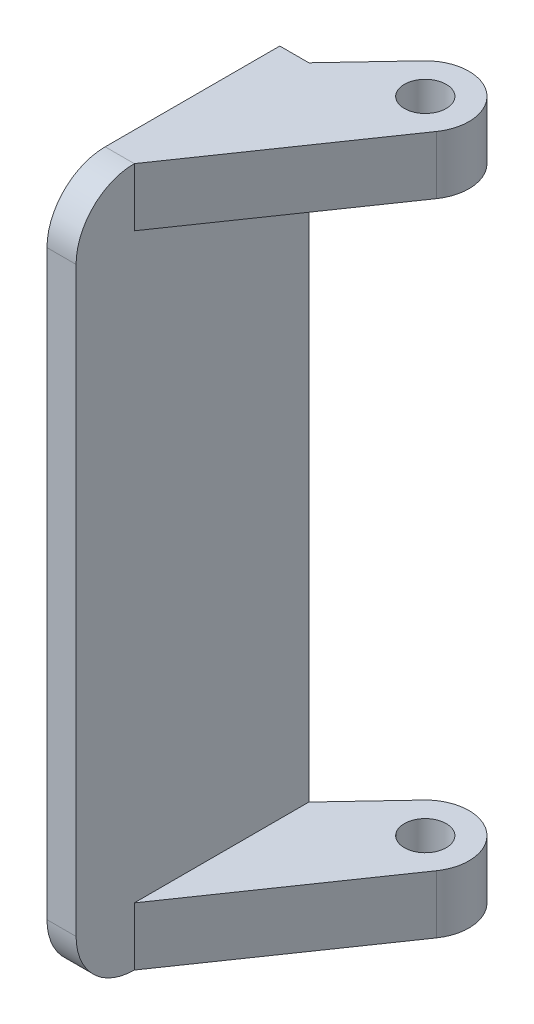
ISO-10303-21;
HEADER;
FILE_DESCRIPTION(('STEP AP214'),'2;1');
FILE_NAME('part.step','',(''),(''),'','','');
FILE_SCHEMA(('AUTOMOTIVE_DESIGN { 1 0 10303 214 1 1 1 1 }'));
ENDSEC;
DATA;
#1=APPLICATION_CONTEXT('core data for automotive mechanical design processes');
#2=APPLICATION_PROTOCOL_DEFINITION('international standard','automotive_design',2000,#1);
#3=PRODUCT_CONTEXT('',#1,'mechanical');
#4=PRODUCT('Part','Part','',(#3));
#5=PRODUCT_RELATED_PRODUCT_CATEGORY('part','',(#4));
#6=PRODUCT_DEFINITION_FORMATION('','',#4);
#7=PRODUCT_DEFINITION_CONTEXT('part definition',#1,'design');
#8=PRODUCT_DEFINITION('design','',#6,#7);
#9=PRODUCT_DEFINITION_SHAPE('','',#8);
#10=(LENGTH_UNIT() NAMED_UNIT(*) SI_UNIT(.MILLI.,.METRE.));
#11=(NAMED_UNIT(*) PLANE_ANGLE_UNIT() SI_UNIT($,.RADIAN.));
#12=(NAMED_UNIT(*) SI_UNIT($,.STERADIAN.) SOLID_ANGLE_UNIT());
#13=UNCERTAINTY_MEASURE_WITH_UNIT(LENGTH_MEASURE(1.E-05),#10,'distance_accuracy_value','');
#14=(GEOMETRIC_REPRESENTATION_CONTEXT(3) GLOBAL_UNCERTAINTY_ASSIGNED_CONTEXT((#13)) GLOBAL_UNIT_ASSIGNED_CONTEXT((#10,
#11,#12)) REPRESENTATION_CONTEXT('',''));
#15=CARTESIAN_POINT('',(0.,0.,0.));
#16=DIRECTION('',(0.,0.,1.));
#17=DIRECTION('',(1.,0.,0.));
#18=AXIS2_PLACEMENT_3D('',#15,#16,#17);
#19=CARTESIAN_POINT('',(-9.525,38.1,22.225));
#20=DIRECTION('',(-0.823554238461005,0.,-0.567237530769002));
#21=DIRECTION('',(-0.567237530769002,0.,0.823554238461005));
#22=AXIS2_PLACEMENT_3D('',#19,#20,#21);
#23=PLANE('',#22);
#24=DIRECTION('',(-0.567237530769002,0.,0.823554238461005));
#25=VECTOR('',#24,1.);
#26=CARTESIAN_POINT('',(-9.525,-31.75,22.225));
#27=LINE('',#26,#25);
#28=CARTESIAN_POINT('',(3.92217706067053,-31.75,2.70146874028737));
#29=VERTEX_POINT('',#28);
#30=CARTESIAN_POINT('',(-9.525,-31.75,22.225));
#31=VERTEX_POINT('',#30);
#32=EDGE_CURVE('E149',#29,#31,#27,.T.);
#33=ORIENTED_EDGE('',*,*,#32,.T.);
#34=DIRECTION('',(0.,-1.,0.));
#35=VECTOR('',#34,1.);
#36=CARTESIAN_POINT('',(-9.525,38.1,22.225));
#37=LINE('',#36,#35);
#38=CARTESIAN_POINT('',(-9.525,-38.1,22.225));
#39=VERTEX_POINT('',#38);
#40=EDGE_CURVE('E146',#31,#39,#37,.T.);
#41=ORIENTED_EDGE('',*,*,#40,.T.);
#42=DIRECTION('',(0.567237530769002,0.,-0.823554238461005));
#43=VECTOR('',#42,1.);
#44=CARTESIAN_POINT('',(-9.525,-38.1,22.225));
#45=LINE('',#44,#43);
#46=CARTESIAN_POINT('',(3.92217706067053,-38.1,2.70146874028737));
#47=VERTEX_POINT('',#46);
#48=EDGE_CURVE('E200',#39,#47,#45,.T.);
#49=ORIENTED_EDGE('',*,*,#48,.T.);
#50=DIRECTION('',(0.,-1.,0.));
#51=VECTOR('',#50,1.);
#52=CARTESIAN_POINT('',(3.92217706067053,38.1,2.70146874028737));
#53=LINE('',#52,#51);
#54=EDGE_CURVE('E211',#29,#47,#53,.T.);
#55=ORIENTED_EDGE('',*,*,#54,.F.);
#56=EDGE_LOOP('',(#33,#41,#49,#55));
#57=FACE_BOUND('',#56,.T.);
#58=ADVANCED_FACE('F45',(#57),#23,.F.);
#59=CARTESIAN_POINT('',(0.,38.1,0.));
#60=DIRECTION('',(0.,-1.,0.));
#61=DIRECTION('',(0.,0.,-1.));
#62=AXIS2_PLACEMENT_3D('',#59,#60,#61);
#63=CYLINDRICAL_SURFACE('',#62,4.7625);
#64=CARTESIAN_POINT('',(0.,-31.75,0.));
#65=DIRECTION('',(0.,1.,0.));
#66=DIRECTION('',(0.,0.,1.));
#67=AXIS2_PLACEMENT_3D('',#64,#65,#66);
#68=CIRCLE('',#67,4.7625);
#69=CARTESIAN_POINT('',(-3.4689488888989,-31.75,-3.2630966666967));
#70=VERTEX_POINT('',#69);
#71=EDGE_CURVE('E157',#70,#29,#68,.F.);
#72=ORIENTED_EDGE('',*,*,#71,.T.);
#73=ORIENTED_EDGE('',*,*,#54,.T.);
#74=CARTESIAN_POINT('',(0.,-38.1,0.));
#75=DIRECTION('',(0.,1.,0.));
#76=DIRECTION('',(0.,0.,1.));
#77=AXIS2_PLACEMENT_3D('',#74,#75,#76);
#78=CIRCLE('',#77,4.7625);
#79=CARTESIAN_POINT('',(-3.4689488888989,-38.1,-3.2630966666967));
#80=VERTEX_POINT('',#79);
#81=EDGE_CURVE('E203',#47,#80,#78,.T.);
#82=ORIENTED_EDGE('',*,*,#81,.T.);
#83=DIRECTION('',(0.,-1.,0.));
#84=VECTOR('',#83,1.);
#85=CARTESIAN_POINT('',(-3.4689488888989,38.1,-3.2630966666967));
#86=LINE('',#85,#84);
#87=EDGE_CURVE('E207',#70,#80,#86,.T.);
#88=ORIENTED_EDGE('',*,*,#87,.F.);
#89=EDGE_LOOP('',(#72,#73,#82,#88));
#90=FACE_BOUND('',#89,.T.);
#91=ADVANCED_FACE('F251',(#90),#63,.T.);
#92=CARTESIAN_POINT('',(-9.525,38.1,3.175));
#93=DIRECTION('',(0.728388218141501,0.,0.685164654424503));
#94=DIRECTION('',(0.685164654424503,0.,-0.728388218141501));
#95=AXIS2_PLACEMENT_3D('',#92,#93,#94);
#96=PLANE('',#95);
#97=DIRECTION('',(0.685164654424503,0.,-0.728388218141501));
#98=VECTOR('',#97,1.);
#99=CARTESIAN_POINT('',(-3.4689488888989,-31.75,-3.2630966666967));
#100=LINE('',#99,#98);
#101=CARTESIAN_POINT('',(-9.525,-31.75,3.175));
#102=VERTEX_POINT('',#101);
#103=EDGE_CURVE('E153',#102,#70,#100,.T.);
#104=ORIENTED_EDGE('',*,*,#103,.T.);
#105=ORIENTED_EDGE('',*,*,#87,.T.);
#106=DIRECTION('',(-0.685164654424503,0.,0.728388218141502));
#107=VECTOR('',#106,1.);
#108=CARTESIAN_POINT('',(-9.525,-38.1,3.175));
#109=LINE('',#108,#107);
#110=CARTESIAN_POINT('',(-9.525,-38.1,3.175));
#111=VERTEX_POINT('',#110);
#112=EDGE_CURVE('E165',#80,#111,#109,.T.);
#113=ORIENTED_EDGE('',*,*,#112,.T.);
#114=DIRECTION('',(0.,-1.,0.));
#115=VECTOR('',#114,1.);
#116=CARTESIAN_POINT('',(-9.525,38.1,3.175));
#117=LINE('',#116,#115);
#118=EDGE_CURVE('E162',#102,#111,#117,.T.);
#119=ORIENTED_EDGE('',*,*,#118,.F.);
#120=EDGE_LOOP('',(#104,#105,#113,#119));
#121=FACE_BOUND('',#120,.T.);
#122=ADVANCED_FACE('F163',(#121),#96,.F.);
#123=CARTESIAN_POINT('',(-12.7,38.1,3.175));
#124=DIRECTION('',(0.,0.,1.));
#125=DIRECTION('',(1.,0.,0.));
#126=AXIS2_PLACEMENT_3D('',#123,#124,#125);
#127=PLANE('',#126);
#128=DIRECTION('',(-1.,0.,0.));
#129=VECTOR('',#128,1.);
#130=CARTESIAN_POINT('',(-12.7,-38.1,3.175));
#131=LINE('',#130,#129);
#132=CARTESIAN_POINT('',(-12.7,-38.1,3.175));
#133=VERTEX_POINT('',#132);
#134=EDGE_CURVE('E195',#111,#133,#131,.T.);
#135=ORIENTED_EDGE('',*,*,#134,.T.);
#136=DIRECTION('',(0.,-1.,0.));
#137=VECTOR('',#136,1.);
#138=CARTESIAN_POINT('',(-12.7,38.1,3.175));
#139=LINE('',#138,#137);
#140=CARTESIAN_POINT('',(-12.7,38.1,3.175));
#141=VERTEX_POINT('',#140);
#142=EDGE_CURVE('E223',#141,#133,#139,.T.);
#143=ORIENTED_EDGE('',*,*,#142,.F.);
#144=DIRECTION('',(-1.,0.,0.));
#145=VECTOR('',#144,1.);
#146=CARTESIAN_POINT('',(-12.7,38.1,3.175));
#147=LINE('',#146,#145);
#148=CARTESIAN_POINT('',(-9.525,38.1,3.175));
#149=VERTEX_POINT('',#148);
#150=EDGE_CURVE('E185',#149,#141,#147,.T.);
#151=ORIENTED_EDGE('',*,*,#150,.F.);
#152=CARTESIAN_POINT('',(-9.525,31.75,3.175));
#153=VERTEX_POINT('',#152);
#154=EDGE_CURVE('E169',#149,#153,#117,.T.);
#155=ORIENTED_EDGE('',*,*,#154,.T.);
#156=DIRECTION('',(0.,-1.,0.));
#157=VECTOR('',#156,1.);
#158=CARTESIAN_POINT('',(-9.525,68.6361721979032,3.175));
#159=LINE('',#158,#157);
#160=EDGE_CURVE('E143',#153,#102,#159,.T.);
#161=ORIENTED_EDGE('',*,*,#160,.T.);
#162=ORIENTED_EDGE('',*,*,#118,.T.);
#163=EDGE_LOOP('',(#135,#143,#151,#155,#161,#162));
#164=FACE_BOUND('',#163,.T.);
#165=ADVANCED_FACE('F173',(#164),#127,.F.);
#166=CARTESIAN_POINT('',(-12.7,38.1,3.175));
#167=DIRECTION('',(1.,0.,0.));
#168=DIRECTION('',(0.,0.,-1.));
#169=AXIS2_PLACEMENT_3D('',#166,#167,#168);
#170=PLANE('',#169);
#171=DIRECTION('',(0.,0.,1.));
#172=VECTOR('',#171,1.);
#173=CARTESIAN_POINT('',(-12.7,-38.1,3.175));
#174=LINE('',#173,#172);
#175=CARTESIAN_POINT('',(-12.7,-38.1,22.225));
#176=VERTEX_POINT('',#175);
#177=EDGE_CURVE('E197',#133,#176,#174,.T.);
#178=ORIENTED_EDGE('',*,*,#177,.T.);
#179=CARTESIAN_POINT('',(-12.7,-31.75,22.225));
#180=DIRECTION('',(1.,0.,0.));
#181=DIRECTION('',(0.,0.,-1.));
#182=AXIS2_PLACEMENT_3D('',#179,#180,#181);
#183=CIRCLE('',#182,6.35);
#184=CARTESIAN_POINT('',(-12.7,-31.75,28.575));
#185=VERTEX_POINT('',#184);
#186=EDGE_CURVE('E54',#176,#185,#183,.F.);
#187=ORIENTED_EDGE('',*,*,#186,.T.);
#188=DIRECTION('',(0.,-1.,0.));
#189=VECTOR('',#188,1.);
#190=CARTESIAN_POINT('',(-12.7,38.1,28.575));
#191=LINE('',#190,#189);
#192=CARTESIAN_POINT('',(-12.7,31.75,28.575));
#193=VERTEX_POINT('',#192);
#194=EDGE_CURVE('E220',#193,#185,#191,.T.);
#195=ORIENTED_EDGE('',*,*,#194,.F.);
#196=CARTESIAN_POINT('',(-12.7,31.75,22.225));
#197=DIRECTION('',(1.,0.,0.));
#198=DIRECTION('',(0.,0.,-1.));
#199=AXIS2_PLACEMENT_3D('',#196,#197,#198);
#200=CIRCLE('',#199,6.35);
#201=CARTESIAN_POINT('',(-12.7,38.1,22.225));
#202=VERTEX_POINT('',#201);
#203=EDGE_CURVE('E61',#193,#202,#200,.F.);
#204=ORIENTED_EDGE('',*,*,#203,.T.);
#205=DIRECTION('',(0.,0.,1.));
#206=VECTOR('',#205,1.);
#207=CARTESIAN_POINT('',(-12.7,38.1,3.175));
#208=LINE('',#207,#206);
#209=EDGE_CURVE('E188',#141,#202,#208,.T.);
#210=ORIENTED_EDGE('',*,*,#209,.F.);
#211=ORIENTED_EDGE('',*,*,#142,.T.);
#212=EDGE_LOOP('',(#178,#187,#195,#204,#210,#211));
#213=FACE_BOUND('',#212,.T.);
#214=ADVANCED_FACE('F238',(#213),#170,.F.);
#215=CARTESIAN_POINT('',(-12.7,38.1,28.575));
#216=DIRECTION('',(0.,0.,-1.));
#217=DIRECTION('',(-1.,0.,0.));
#218=AXIS2_PLACEMENT_3D('',#215,#216,#217);
#219=PLANE('',#218);
#220=ORIENTED_EDGE('',*,*,#194,.T.);
#221=DIRECTION('',(1.,0.,0.));
#222=VECTOR('',#221,1.);
#223=CARTESIAN_POINT('',(-12.7,-31.75,28.575));
#224=LINE('',#223,#222);
#225=CARTESIAN_POINT('',(-9.525,-31.75,28.575));
#226=VERTEX_POINT('',#225);
#227=EDGE_CURVE('E228',#185,#226,#224,.T.);
#228=ORIENTED_EDGE('',*,*,#227,.T.);
#229=DIRECTION('',(0.,-1.,0.));
#230=VECTOR('',#229,1.);
#231=CARTESIAN_POINT('',(-9.525,38.1,28.575));
#232=LINE('',#231,#230);
#233=CARTESIAN_POINT('',(-9.525,31.75,28.575));
#234=VERTEX_POINT('',#233);
#235=EDGE_CURVE('E218',#234,#226,#232,.T.);
#236=ORIENTED_EDGE('',*,*,#235,.F.);
#237=DIRECTION('',(1.,0.,0.));
#238=VECTOR('',#237,1.);
#239=CARTESIAN_POINT('',(-12.7,31.75,28.575));
#240=LINE('',#239,#238);
#241=EDGE_CURVE('E226',#234,#193,#240,.F.);
#242=ORIENTED_EDGE('',*,*,#241,.T.);
#243=EDGE_LOOP('',(#220,#228,#236,#242));
#244=FACE_BOUND('',#243,.T.);
#245=ADVANCED_FACE('F242',(#244),#219,.F.);
#246=CARTESIAN_POINT('',(-9.525,38.1,28.575));
#247=DIRECTION('',(-1.,0.,0.));
#248=DIRECTION('',(0.,0.,1.));
#249=AXIS2_PLACEMENT_3D('',#246,#247,#248);
#250=PLANE('',#249);
#251=ORIENTED_EDGE('',*,*,#235,.T.);
#252=CARTESIAN_POINT('',(-9.525,-31.75,22.225));
#253=DIRECTION('',(-1.,0.,0.));
#254=DIRECTION('',(0.,0.,1.));
#255=AXIS2_PLACEMENT_3D('',#252,#253,#254);
#256=CIRCLE('',#255,6.35);
#257=EDGE_CURVE('E233',#226,#39,#256,.F.);
#258=ORIENTED_EDGE('',*,*,#257,.T.);
#259=ORIENTED_EDGE('',*,*,#40,.F.);
#260=DIRECTION('',(0.,0.,-1.));
#261=VECTOR('',#260,1.);
#262=CARTESIAN_POINT('',(-9.525,-31.75,22.225));
#263=LINE('',#262,#261);
#264=EDGE_CURVE('E137',#31,#102,#263,.T.);
#265=ORIENTED_EDGE('',*,*,#264,.T.);
#266=ORIENTED_EDGE('',*,*,#160,.F.);
#267=DIRECTION('',(0.,0.,1.));
#268=VECTOR('',#267,1.);
#269=CARTESIAN_POINT('',(-9.525,31.75,22.225));
#270=LINE('',#269,#268);
#271=CARTESIAN_POINT('',(-9.525,31.75,22.225));
#272=VERTEX_POINT('',#271);
#273=EDGE_CURVE('E198',#153,#272,#270,.T.);
#274=ORIENTED_EDGE('',*,*,#273,.T.);
#275=CARTESIAN_POINT('',(-9.525,38.1,22.225));
#276=VERTEX_POINT('',#275);
#277=EDGE_CURVE('E215',#276,#272,#37,.T.);
#278=ORIENTED_EDGE('',*,*,#277,.F.);
#279=CARTESIAN_POINT('',(-9.525,31.75,22.225));
#280=DIRECTION('',(-1.,0.,0.));
#281=DIRECTION('',(0.,0.,1.));
#282=AXIS2_PLACEMENT_3D('',#279,#280,#281);
#283=CIRCLE('',#282,6.35);
#284=EDGE_CURVE('E231',#276,#234,#283,.F.);
#285=ORIENTED_EDGE('',*,*,#284,.T.);
#286=EDGE_LOOP('',(#251,#258,#259,#265,#266,#274,#278,#285));
#287=FACE_BOUND('',#286,.T.);
#288=ADVANCED_FACE('F140',(#287),#250,.F.);
#289=ORIENTED_EDGE('',*,*,#277,.T.);
#290=DIRECTION('',(0.567237530769002,0.,-0.823554238461005));
#291=VECTOR('',#290,1.);
#292=CARTESIAN_POINT('',(-9.525,31.75,22.225));
#293=LINE('',#292,#291);
#294=CARTESIAN_POINT('',(3.92217706067053,31.75,2.70146874028737));
#295=VERTEX_POINT('',#294);
#296=EDGE_CURVE('E177',#272,#295,#293,.T.);
#297=ORIENTED_EDGE('',*,*,#296,.T.);
#298=CARTESIAN_POINT('',(3.92217706067053,38.1,2.70146874028737));
#299=VERTEX_POINT('',#298);
#300=EDGE_CURVE('E212',#299,#295,#53,.T.);
#301=ORIENTED_EDGE('',*,*,#300,.F.);
#302=DIRECTION('',(0.567237530769002,0.,-0.823554238461005));
#303=VECTOR('',#302,1.);
#304=CARTESIAN_POINT('',(-9.525,38.1,22.225));
#305=LINE('',#304,#303);
#306=EDGE_CURVE('E190',#276,#299,#305,.T.);
#307=ORIENTED_EDGE('',*,*,#306,.F.);
#308=EDGE_LOOP('',(#289,#297,#301,#307));
#309=FACE_BOUND('',#308,.T.);
#310=ADVANCED_FACE('F274',(#309),#23,.F.);
#311=ORIENTED_EDGE('',*,*,#300,.T.);
#312=CARTESIAN_POINT('',(0.,31.75,0.));
#313=DIRECTION('',(0.,1.,0.));
#314=DIRECTION('',(0.,0.,1.));
#315=AXIS2_PLACEMENT_3D('',#312,#313,#314);
#316=CIRCLE('',#315,4.7625);
#317=CARTESIAN_POINT('',(-3.4689488888989,31.75,-3.2630966666967));
#318=VERTEX_POINT('',#317);
#319=EDGE_CURVE('E181',#295,#318,#316,.T.);
#320=ORIENTED_EDGE('',*,*,#319,.T.);
#321=CARTESIAN_POINT('',(-3.4689488888989,38.1,-3.2630966666967));
#322=VERTEX_POINT('',#321);
#323=EDGE_CURVE('E208',#322,#318,#86,.T.);
#324=ORIENTED_EDGE('',*,*,#323,.F.);
#325=CARTESIAN_POINT('',(0.,38.1,0.));
#326=DIRECTION('',(0.,1.,0.));
#327=DIRECTION('',(0.,0.,1.));
#328=AXIS2_PLACEMENT_3D('',#325,#326,#327);
#329=CIRCLE('',#328,4.7625);
#330=EDGE_CURVE('E192',#299,#322,#329,.T.);
#331=ORIENTED_EDGE('',*,*,#330,.F.);
#332=EDGE_LOOP('',(#311,#320,#324,#331));
#333=FACE_BOUND('',#332,.T.);
#334=ADVANCED_FACE('F260',(#333),#63,.T.);
#335=ORIENTED_EDGE('',*,*,#323,.T.);
#336=DIRECTION('',(-0.685164654424503,0.,0.728388218141501));
#337=VECTOR('',#336,1.);
#338=CARTESIAN_POINT('',(-3.4689488888989,31.75,-3.2630966666967));
#339=LINE('',#338,#337);
#340=EDGE_CURVE('E256',#318,#153,#339,.T.);
#341=ORIENTED_EDGE('',*,*,#340,.T.);
#342=ORIENTED_EDGE('',*,*,#154,.F.);
#343=DIRECTION('',(-0.685164654424503,0.,0.728388218141502));
#344=VECTOR('',#343,1.);
#345=CARTESIAN_POINT('',(-9.525,38.1,3.175));
#346=LINE('',#345,#344);
#347=EDGE_CURVE('E170',#322,#149,#346,.T.);
#348=ORIENTED_EDGE('',*,*,#347,.F.);
#349=EDGE_LOOP('',(#335,#341,#342,#348));
#350=FACE_BOUND('',#349,.T.);
#351=ADVANCED_FACE('F266',(#350),#96,.F.);
#352=CARTESIAN_POINT('',(0.,38.1,0.));
#353=DIRECTION('',(0.,1.,0.));
#354=DIRECTION('',(0.,0.,1.));
#355=AXIS2_PLACEMENT_3D('',#352,#353,#354);
#356=PLANE('',#355);
#357=CARTESIAN_POINT('',(0.,38.1,0.));
#358=DIRECTION('',(0.,1.,0.));
#359=DIRECTION('',(0.,0.,1.));
#360=AXIS2_PLACEMENT_3D('',#357,#358,#359);
#361=CIRCLE('',#360,2.286);
#362=CARTESIAN_POINT('',(0.,38.1,2.286));
#363=VERTEX_POINT('',#362);
#364=EDGE_CURVE('E338',#363,#363,#361,.T.);
#365=ORIENTED_EDGE('',*,*,#364,.F.);
#366=EDGE_LOOP('',(#365));
#367=FACE_BOUND('',#366,.T.);
#368=ORIENTED_EDGE('',*,*,#209,.T.);
#369=DIRECTION('',(1.,0.,0.));
#370=VECTOR('',#369,1.);
#371=CARTESIAN_POINT('',(-9.525,38.1,22.225));
#372=LINE('',#371,#370);
#373=EDGE_CURVE('E12',#202,#276,#372,.T.);
#374=ORIENTED_EDGE('',*,*,#373,.T.);
#375=ORIENTED_EDGE('',*,*,#306,.T.);
#376=ORIENTED_EDGE('',*,*,#330,.T.);
#377=ORIENTED_EDGE('',*,*,#347,.T.);
#378=ORIENTED_EDGE('',*,*,#150,.T.);
#379=EDGE_LOOP('',(#368,#374,#375,#376,#377,#378));
#380=FACE_BOUND('',#379,.T.);
#381=ADVANCED_FACE('F268',(#367,#380),#356,.T.);
#382=CARTESIAN_POINT('',(0.,-38.1,0.));
#383=DIRECTION('',(0.,1.,0.));
#384=DIRECTION('',(0.,0.,1.));
#385=AXIS2_PLACEMENT_3D('',#382,#383,#384);
#386=PLANE('',#385);
#387=CARTESIAN_POINT('',(0.,-38.1,0.));
#388=DIRECTION('',(0.,1.,0.));
#389=DIRECTION('',(0.,0.,1.));
#390=AXIS2_PLACEMENT_3D('',#387,#388,#389);
#391=CIRCLE('',#390,2.286);
#392=CARTESIAN_POINT('',(0.,-38.1,2.286));
#393=VERTEX_POINT('',#392);
#394=EDGE_CURVE('E334',#393,#393,#391,.T.);
#395=ORIENTED_EDGE('',*,*,#394,.T.);
#396=EDGE_LOOP('',(#395));
#397=FACE_BOUND('',#396,.T.);
#398=ORIENTED_EDGE('',*,*,#48,.F.);
#399=DIRECTION('',(1.,0.,0.));
#400=VECTOR('',#399,1.);
#401=CARTESIAN_POINT('',(0.,-38.1,22.225));
#402=LINE('',#401,#400);
#403=EDGE_CURVE('E69',#39,#176,#402,.F.);
#404=ORIENTED_EDGE('',*,*,#403,.T.);
#405=ORIENTED_EDGE('',*,*,#177,.F.);
#406=ORIENTED_EDGE('',*,*,#134,.F.);
#407=ORIENTED_EDGE('',*,*,#112,.F.);
#408=ORIENTED_EDGE('',*,*,#81,.F.);
#409=EDGE_LOOP('',(#398,#404,#405,#406,#407,#408));
#410=FACE_BOUND('',#409,.T.);
#411=ADVANCED_FACE('F249',(#397,#410),#386,.F.);
#412=CARTESIAN_POINT('',(0.,31.75,0.));
#413=DIRECTION('',(0.,1.,0.));
#414=DIRECTION('',(0.,0.,1.));
#415=AXIS2_PLACEMENT_3D('',#412,#413,#414);
#416=PLANE('',#415);
#417=CARTESIAN_POINT('',(0.,31.75,0.));
#418=DIRECTION('',(0.,1.,0.));
#419=DIRECTION('',(0.,0.,1.));
#420=AXIS2_PLACEMENT_3D('',#417,#418,#419);
#421=CIRCLE('',#420,2.286);
#422=CARTESIAN_POINT('',(0.,31.75,2.286));
#423=VERTEX_POINT('',#422);
#424=EDGE_CURVE('E150',#423,#423,#421,.T.);
#425=ORIENTED_EDGE('',*,*,#424,.T.);
#426=EDGE_LOOP('',(#425));
#427=FACE_BOUND('',#426,.T.);
#428=ORIENTED_EDGE('',*,*,#296,.F.);
#429=ORIENTED_EDGE('',*,*,#273,.F.);
#430=ORIENTED_EDGE('',*,*,#340,.F.);
#431=ORIENTED_EDGE('',*,*,#319,.F.);
#432=EDGE_LOOP('',(#428,#429,#430,#431));
#433=FACE_BOUND('',#432,.T.);
#434=ADVANCED_FACE('F275',(#427,#433),#416,.F.);
#435=CARTESIAN_POINT('',(0.,-31.75,0.));
#436=DIRECTION('',(0.,1.,0.));
#437=DIRECTION('',(0.,0.,1.));
#438=AXIS2_PLACEMENT_3D('',#435,#436,#437);
#439=PLANE('',#438);
#440=CARTESIAN_POINT('',(0.,-31.75,0.));
#441=DIRECTION('',(0.,1.,0.));
#442=DIRECTION('',(0.,0.,1.));
#443=AXIS2_PLACEMENT_3D('',#440,#441,#442);
#444=CIRCLE('',#443,2.286);
#445=CARTESIAN_POINT('',(0.,-31.75,2.286));
#446=VERTEX_POINT('',#445);
#447=EDGE_CURVE('E49',#446,#446,#444,.T.);
#448=ORIENTED_EDGE('',*,*,#447,.F.);
#449=EDGE_LOOP('',(#448));
#450=FACE_BOUND('',#449,.T.);
#451=ORIENTED_EDGE('',*,*,#71,.F.);
#452=ORIENTED_EDGE('',*,*,#103,.F.);
#453=ORIENTED_EDGE('',*,*,#264,.F.);
#454=ORIENTED_EDGE('',*,*,#32,.F.);
#455=EDGE_LOOP('',(#451,#452,#453,#454));
#456=FACE_BOUND('',#455,.T.);
#457=ADVANCED_FACE('F155',(#450,#456),#439,.T.);
#458=CARTESIAN_POINT('',(-12.7,-31.75,22.225));
#459=DIRECTION('',(1.,0.,0.));
#460=DIRECTION('',(0.,0.,-1.));
#461=AXIS2_PLACEMENT_3D('',#458,#459,#460);
#462=CYLINDRICAL_SURFACE('',#461,6.35);
#463=ORIENTED_EDGE('',*,*,#186,.F.);
#464=ORIENTED_EDGE('',*,*,#403,.F.);
#465=ORIENTED_EDGE('',*,*,#257,.F.);
#466=ORIENTED_EDGE('',*,*,#227,.F.);
#467=EDGE_LOOP('',(#463,#464,#465,#466));
#468=FACE_BOUND('',#467,.T.);
#469=ADVANCED_FACE('F245',(#468),#462,.T.);
#470=CARTESIAN_POINT('',(0.,31.75,22.225));
#471=DIRECTION('',(-1.,0.,0.));
#472=DIRECTION('',(0.,0.,1.));
#473=AXIS2_PLACEMENT_3D('',#470,#471,#472);
#474=CYLINDRICAL_SURFACE('',#473,6.35);
#475=ORIENTED_EDGE('',*,*,#203,.F.);
#476=ORIENTED_EDGE('',*,*,#241,.F.);
#477=ORIENTED_EDGE('',*,*,#284,.F.);
#478=ORIENTED_EDGE('',*,*,#373,.F.);
#479=EDGE_LOOP('',(#475,#476,#477,#478));
#480=FACE_BOUND('',#479,.T.);
#481=ADVANCED_FACE('F47',(#480),#474,.T.);
#482=CARTESIAN_POINT('',(0.,-38.1,0.));
#483=DIRECTION('',(0.,1.,0.));
#484=DIRECTION('',(0.,0.,1.));
#485=AXIS2_PLACEMENT_3D('',#482,#483,#484);
#486=CYLINDRICAL_SURFACE('',#485,2.286);
#487=CARTESIAN_POINT('',(0.,-31.75,2.286));
#488=CARTESIAN_POINT('',(0.,-31.8161458333333,2.286));
#489=CARTESIAN_POINT('',(0.,-31.8822916666667,2.286));
#490=CARTESIAN_POINT('',(0.,-32.0145833333333,2.286));
#491=CARTESIAN_POINT('',(0.,-32.0807291666667,2.286));
#492=CARTESIAN_POINT('',(0.,-32.2130208333333,2.286));
#493=CARTESIAN_POINT('',(0.,-32.2791666666667,2.286));
#494=CARTESIAN_POINT('',(0.,-32.4114583333333,2.286));
#495=CARTESIAN_POINT('',(0.,-32.4776041666667,2.286));
#496=CARTESIAN_POINT('',(0.,-32.6098958333333,2.286));
#497=CARTESIAN_POINT('',(0.,-32.6760416666667,2.286));
#498=CARTESIAN_POINT('',(0.,-32.8083333333333,2.286));
#499=CARTESIAN_POINT('',(0.,-32.8744791666667,2.286));
#500=CARTESIAN_POINT('',(0.,-33.0067708333333,2.286));
#501=CARTESIAN_POINT('',(0.,-33.0729166666667,2.286));
#502=CARTESIAN_POINT('',(0.,-33.2052083333333,2.286));
#503=CARTESIAN_POINT('',(0.,-33.2713541666667,2.286));
#504=CARTESIAN_POINT('',(0.,-33.4036458333333,2.286));
#505=CARTESIAN_POINT('',(0.,-33.4697916666667,2.286));
#506=CARTESIAN_POINT('',(0.,-33.6020833333333,2.286));
#507=CARTESIAN_POINT('',(0.,-33.6682291666667,2.286));
#508=CARTESIAN_POINT('',(0.,-33.8005208333333,2.286));
#509=CARTESIAN_POINT('',(0.,-33.8666666666667,2.286));
#510=CARTESIAN_POINT('',(0.,-33.9989583333333,2.286));
#511=CARTESIAN_POINT('',(0.,-34.0651041666667,2.286));
#512=CARTESIAN_POINT('',(0.,-34.1973958333333,2.286));
#513=CARTESIAN_POINT('',(0.,-34.2635416666667,2.286));
#514=CARTESIAN_POINT('',(0.,-34.3958333333333,2.286));
#515=CARTESIAN_POINT('',(0.,-34.4619791666667,2.286));
#516=CARTESIAN_POINT('',(0.,-34.5942708333333,2.286));
#517=CARTESIAN_POINT('',(0.,-34.6604166666667,2.286));
#518=CARTESIAN_POINT('',(0.,-34.7927083333333,2.286));
#519=CARTESIAN_POINT('',(0.,-34.8588541666667,2.286));
#520=CARTESIAN_POINT('',(0.,-34.9911458333333,2.286));
#521=CARTESIAN_POINT('',(0.,-35.0572916666667,2.286));
#522=CARTESIAN_POINT('',(0.,-35.1895833333333,2.286));
#523=CARTESIAN_POINT('',(0.,-35.2557291666667,2.286));
#524=CARTESIAN_POINT('',(0.,-35.3880208333333,2.286));
#525=CARTESIAN_POINT('',(0.,-35.4541666666667,2.286));
#526=CARTESIAN_POINT('',(0.,-35.5864583333333,2.286));
#527=CARTESIAN_POINT('',(0.,-35.6526041666667,2.286));
#528=CARTESIAN_POINT('',(0.,-35.7848958333333,2.286));
#529=CARTESIAN_POINT('',(0.,-35.8510416666667,2.286));
#530=CARTESIAN_POINT('',(0.,-35.9833333333333,2.286));
#531=CARTESIAN_POINT('',(0.,-36.0494791666667,2.286));
#532=CARTESIAN_POINT('',(0.,-36.1817708333333,2.286));
#533=CARTESIAN_POINT('',(0.,-36.2479166666667,2.286));
#534=CARTESIAN_POINT('',(0.,-36.3802083333333,2.286));
#535=CARTESIAN_POINT('',(0.,-36.4463541666667,2.286));
#536=CARTESIAN_POINT('',(0.,-36.5786458333333,2.286));
#537=CARTESIAN_POINT('',(0.,-36.6447916666667,2.286));
#538=CARTESIAN_POINT('',(0.,-36.7770833333333,2.286));
#539=CARTESIAN_POINT('',(0.,-36.8432291666667,2.286));
#540=CARTESIAN_POINT('',(0.,-36.9755208333333,2.286));
#541=CARTESIAN_POINT('',(0.,-37.0416666666667,2.286));
#542=CARTESIAN_POINT('',(0.,-37.1739583333333,2.286));
#543=CARTESIAN_POINT('',(0.,-37.2401041666667,2.286));
#544=CARTESIAN_POINT('',(0.,-37.3723958333333,2.286));
#545=CARTESIAN_POINT('',(0.,-37.4385416666667,2.286));
#546=CARTESIAN_POINT('',(0.,-37.5708333333333,2.286));
#547=CARTESIAN_POINT('',(0.,-37.6369791666667,2.286));
#548=CARTESIAN_POINT('',(0.,-37.7692708333333,2.286));
#549=CARTESIAN_POINT('',(0.,-37.8354166666667,2.286));
#550=CARTESIAN_POINT('',(0.,-37.9677083333333,2.286));
#551=CARTESIAN_POINT('',(0.,-38.0338541666667,2.286));
#552=CARTESIAN_POINT('',(0.,-38.1,2.286));
#553=B_SPLINE_CURVE_WITH_KNOTS('',3,(#487,#488,#489,#490,#491,#492,#493,#494,#495,#496,#497,
#498,#499,#500,#501,#502,#503,#504,#505,#506,#507,#508,#509,#510,#511,#512,#513,#514,#515,#516,
#517,#518,#519,#520,#521,#522,#523,#524,#525,#526,#527,#528,#529,#530,#531,#532,#533,#534,#535,
#536,#537,#538,#539,#540,#541,#542,#543,#544,#545,#546,#547,#548,#549,#550,#551,#552),
.UNSPECIFIED.,.F.,.F.,(4,2,2,2,2,2,2,2,2,2,2,2,2,2,2,2,2,2,2,2,2,2,2,2,2,2,2,2,2,2,2,2,4),(0.,
0.198437499999995,0.396874999999998,0.5953125,0.793749999999996,0.992187499999998,1.190625,
1.3890625,1.5875,1.78593749999999,1.984375,2.1828125,2.38124999999999,2.5796875,2.778125,
2.97656249999999,3.175,3.3734375,3.571875,3.7703125,3.96875,4.1671875,4.365625,4.5640625,4.7625,
4.9609375,5.159375,5.3578125,5.55625,5.7546875,5.953125,6.1515625,6.34999999999999),.UNSPECIFIED.);
#554=EDGE_CURVE('BSEAM278',#446,#393,#553,.T.);
#555=ORIENTED_EDGE('',*,*,#447,.T.);
#556=ORIENTED_EDGE('',*,*,#394,.F.);
#557=ORIENTED_EDGE('',*,*,#554,.T.);
#558=ORIENTED_EDGE('',*,*,#554,.F.);
#559=EDGE_LOOP('',(#555,#557,#556,#558));
#560=FACE_BOUND('',#559,.T.);
#561=ADVANCED_FACE('F278',(#560),#486,.F.);
#562=CARTESIAN_POINT('',(0.,38.1,2.286));
#563=CARTESIAN_POINT('',(0.,38.0338541666667,2.286));
#564=CARTESIAN_POINT('',(0.,37.9677083333333,2.286));
#565=CARTESIAN_POINT('',(0.,37.8354166666667,2.286));
#566=CARTESIAN_POINT('',(0.,37.7692708333333,2.286));
#567=CARTESIAN_POINT('',(0.,37.6369791666667,2.286));
#568=CARTESIAN_POINT('',(0.,37.5708333333333,2.286));
#569=CARTESIAN_POINT('',(0.,37.4385416666667,2.286));
#570=CARTESIAN_POINT('',(0.,37.3723958333333,2.286));
#571=CARTESIAN_POINT('',(0.,37.2401041666667,2.286));
#572=CARTESIAN_POINT('',(0.,37.1739583333333,2.286));
#573=CARTESIAN_POINT('',(0.,37.0416666666667,2.286));
#574=CARTESIAN_POINT('',(0.,36.9755208333333,2.286));
#575=CARTESIAN_POINT('',(0.,36.8432291666667,2.286));
#576=CARTESIAN_POINT('',(0.,36.7770833333333,2.286));
#577=CARTESIAN_POINT('',(0.,36.6447916666667,2.286));
#578=CARTESIAN_POINT('',(0.,36.5786458333333,2.286));
#579=CARTESIAN_POINT('',(0.,36.4463541666667,2.286));
#580=CARTESIAN_POINT('',(0.,36.3802083333333,2.286));
#581=CARTESIAN_POINT('',(0.,36.2479166666667,2.286));
#582=CARTESIAN_POINT('',(0.,36.1817708333333,2.286));
#583=CARTESIAN_POINT('',(0.,36.0494791666667,2.286));
#584=CARTESIAN_POINT('',(0.,35.9833333333333,2.286));
#585=CARTESIAN_POINT('',(0.,35.8510416666667,2.286));
#586=CARTESIAN_POINT('',(0.,35.7848958333333,2.286));
#587=CARTESIAN_POINT('',(0.,35.6526041666667,2.286));
#588=CARTESIAN_POINT('',(0.,35.5864583333333,2.286));
#589=CARTESIAN_POINT('',(0.,35.4541666666667,2.286));
#590=CARTESIAN_POINT('',(0.,35.3880208333333,2.286));
#591=CARTESIAN_POINT('',(0.,35.2557291666667,2.286));
#592=CARTESIAN_POINT('',(0.,35.1895833333333,2.286));
#593=CARTESIAN_POINT('',(0.,35.0572916666667,2.286));
#594=CARTESIAN_POINT('',(0.,34.9911458333333,2.286));
#595=CARTESIAN_POINT('',(0.,34.8588541666667,2.286));
#596=CARTESIAN_POINT('',(0.,34.7927083333333,2.286));
#597=CARTESIAN_POINT('',(0.,34.6604166666667,2.286));
#598=CARTESIAN_POINT('',(0.,34.5942708333333,2.286));
#599=CARTESIAN_POINT('',(0.,34.4619791666667,2.286));
#600=CARTESIAN_POINT('',(0.,34.3958333333333,2.286));
#601=CARTESIAN_POINT('',(0.,34.2635416666667,2.286));
#602=CARTESIAN_POINT('',(0.,34.1973958333333,2.286));
#603=CARTESIAN_POINT('',(0.,34.0651041666667,2.286));
#604=CARTESIAN_POINT('',(0.,33.9989583333333,2.286));
#605=CARTESIAN_POINT('',(0.,33.8666666666667,2.286));
#606=CARTESIAN_POINT('',(0.,33.8005208333333,2.286));
#607=CARTESIAN_POINT('',(0.,33.6682291666667,2.286));
#608=CARTESIAN_POINT('',(0.,33.6020833333333,2.286));
#609=CARTESIAN_POINT('',(0.,33.4697916666667,2.286));
#610=CARTESIAN_POINT('',(0.,33.4036458333333,2.286));
#611=CARTESIAN_POINT('',(0.,33.2713541666667,2.286));
#612=CARTESIAN_POINT('',(0.,33.2052083333333,2.286));
#613=CARTESIAN_POINT('',(0.,33.0729166666667,2.286));
#614=CARTESIAN_POINT('',(0.,33.0067708333333,2.286));
#615=CARTESIAN_POINT('',(0.,32.8744791666667,2.286));
#616=CARTESIAN_POINT('',(0.,32.8083333333333,2.286));
#617=CARTESIAN_POINT('',(0.,32.6760416666667,2.286));
#618=CARTESIAN_POINT('',(0.,32.6098958333333,2.286));
#619=CARTESIAN_POINT('',(0.,32.4776041666667,2.286));
#620=CARTESIAN_POINT('',(0.,32.4114583333333,2.286));
#621=CARTESIAN_POINT('',(0.,32.2791666666666,2.286));
#622=CARTESIAN_POINT('',(0.,32.2130208333333,2.286));
#623=CARTESIAN_POINT('',(0.,32.0807291666667,2.286));
#624=CARTESIAN_POINT('',(0.,32.0145833333333,2.286));
#625=CARTESIAN_POINT('',(0.,31.8822916666666,2.286));
#626=CARTESIAN_POINT('',(0.,31.8161458333333,2.286));
#627=CARTESIAN_POINT('',(0.,31.75,2.286));
#628=B_SPLINE_CURVE_WITH_KNOTS('',3,(#562,#563,#564,#565,#566,#567,#568,#569,#570,#571,#572,
#573,#574,#575,#576,#577,#578,#579,#580,#581,#582,#583,#584,#585,#586,#587,#588,#589,#590,#591,
#592,#593,#594,#595,#596,#597,#598,#599,#600,#601,#602,#603,#604,#605,#606,#607,#608,#609,#610,
#611,#612,#613,#614,#615,#616,#617,#618,#619,#620,#621,#622,#623,#624,#625,#626,#627),
.UNSPECIFIED.,.F.,.F.,(4,2,2,2,2,2,2,2,2,2,2,2,2,2,2,2,2,2,2,2,2,2,2,2,2,2,2,2,2,2,2,2,4),(0.,
0.198437499999995,0.396875000000005,0.5953125,0.79375000000001,0.992187500000005,1.190625,
1.38906250000001,1.58750000000001,1.7859375,1.98437500000001,2.18281250000001,2.38125,
2.57968750000001,2.77812500000001,2.97656250000002,3.17500000000001,3.37343750000001,
3.57187500000002,3.77031250000001,3.96875000000002,4.16718750000002,4.36562500000001,
4.56406250000002,4.76250000000002,4.96093750000001,5.15937500000002,5.35781250000002,
5.55625000000001,5.75468750000002,5.95312500000002,6.15156250000003,6.35000000000002),.UNSPECIFIED.);
#629=EDGE_CURVE('BSEAM284',#363,#423,#628,.T.);
#630=ORIENTED_EDGE('',*,*,#364,.T.);
#631=ORIENTED_EDGE('',*,*,#424,.F.);
#632=ORIENTED_EDGE('',*,*,#629,.T.);
#633=ORIENTED_EDGE('',*,*,#629,.F.);
#634=EDGE_LOOP('',(#630,#632,#631,#633));
#635=FACE_BOUND('',#634,.T.);
#636=ADVANCED_FACE('F284',(#635),#486,.F.);
#637=CLOSED_SHELL('',(#58,#91,#122,#165,#214,#245,#288,#310,#334,#351,#381,#411,#434,#457,#469,
#481,#561,#636));
#638=MANIFOLD_SOLID_BREP('B2',#637);
#639=ADVANCED_BREP_SHAPE_REPRESENTATION('',(#18,#638),#14);
#640=SHAPE_DEFINITION_REPRESENTATION(#9,#639);
ENDSEC;
END-ISO-10303-21;
